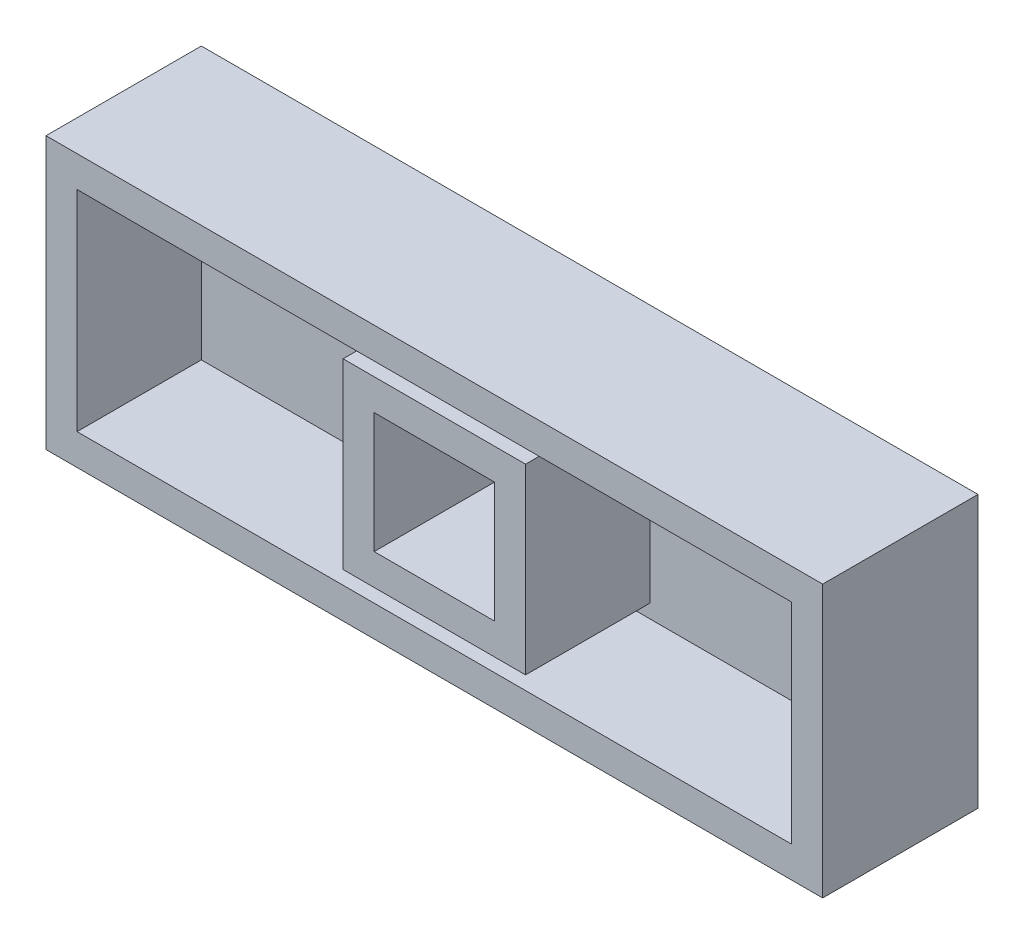
ISO-10303-21;
HEADER;
FILE_DESCRIPTION(('STEP AP214'),'2;1');
FILE_NAME('part.step','',(''),(''),'','','');
FILE_SCHEMA(('AUTOMOTIVE_DESIGN { 1 0 10303 214 1 1 1 1 }'));
ENDSEC;
DATA;
#1=APPLICATION_CONTEXT('core data for automotive mechanical design processes');
#2=APPLICATION_PROTOCOL_DEFINITION('international standard','automotive_design',2000,#1);
#3=PRODUCT_CONTEXT('',#1,'mechanical');
#4=PRODUCT('Part','Part','',(#3));
#5=PRODUCT_RELATED_PRODUCT_CATEGORY('part','',(#4));
#6=PRODUCT_DEFINITION_FORMATION('','',#4);
#7=PRODUCT_DEFINITION_CONTEXT('part definition',#1,'design');
#8=PRODUCT_DEFINITION('design','',#6,#7);
#9=PRODUCT_DEFINITION_SHAPE('','',#8);
#10=(LENGTH_UNIT() NAMED_UNIT(*) SI_UNIT(.MILLI.,.METRE.));
#11=(NAMED_UNIT(*) PLANE_ANGLE_UNIT() SI_UNIT($,.RADIAN.));
#12=(NAMED_UNIT(*) SI_UNIT($,.STERADIAN.) SOLID_ANGLE_UNIT());
#13=UNCERTAINTY_MEASURE_WITH_UNIT(LENGTH_MEASURE(1.E-05),#10,'distance_accuracy_value','');
#14=(GEOMETRIC_REPRESENTATION_CONTEXT(3) GLOBAL_UNCERTAINTY_ASSIGNED_CONTEXT((#13)) GLOBAL_UNIT_ASSIGNED_CONTEXT((#10,
#11,#12)) REPRESENTATION_CONTEXT('',''));
#15=CARTESIAN_POINT('',(0.,0.,0.));
#16=DIRECTION('',(0.,0.,1.));
#17=DIRECTION('',(1.,0.,0.));
#18=AXIS2_PLACEMENT_3D('',#15,#16,#17);
#19=CARTESIAN_POINT('',(0.,0.,4.));
#20=DIRECTION('',(0.,0.,-1.));
#21=DIRECTION('',(-1.,0.,0.));
#22=AXIS2_PLACEMENT_3D('',#19,#20,#21);
#23=PLANE('',#22);
#24=DIRECTION('',(0.,-1.,0.));
#25=VECTOR('',#24,1.);
#26=CARTESIAN_POINT('',(-8.45,-1.95,4.));
#27=LINE('',#26,#25);
#28=CARTESIAN_POINT('',(-8.45,5.05,4.));
#29=VERTEX_POINT('',#28);
#30=CARTESIAN_POINT('',(-8.45,-1.95,4.));
#31=VERTEX_POINT('',#30);
#32=EDGE_CURVE('E291',#29,#31,#27,.T.);
#33=ORIENTED_EDGE('',*,*,#32,.T.);
#34=DIRECTION('',(1.,0.,0.));
#35=VECTOR('',#34,1.);
#36=CARTESIAN_POINT('',(-8.45,-1.95,4.));
#37=LINE('',#36,#35);
#38=CARTESIAN_POINT('',(11.55,-1.95,4.));
#39=VERTEX_POINT('',#38);
#40=EDGE_CURVE('E295',#31,#39,#37,.T.);
#41=ORIENTED_EDGE('',*,*,#40,.T.);
#42=DIRECTION('',(0.,1.,0.));
#43=VECTOR('',#42,1.);
#44=CARTESIAN_POINT('',(11.55,-1.95,4.));
#45=LINE('',#44,#43);
#46=CARTESIAN_POINT('',(11.55,5.05,4.));
#47=VERTEX_POINT('',#46);
#48=EDGE_CURVE('E299',#39,#47,#45,.T.);
#49=ORIENTED_EDGE('',*,*,#48,.T.);
#50=DIRECTION('',(-1.,0.,0.));
#51=VECTOR('',#50,1.);
#52=CARTESIAN_POINT('',(-8.45,5.05,4.));
#53=LINE('',#52,#51);
#54=EDGE_CURVE('E302',#47,#29,#53,.T.);
#55=ORIENTED_EDGE('',*,*,#54,.T.);
#56=EDGE_LOOP('',(#33,#41,#49,#55));
#57=FACE_BOUND('',#56,.T.);
#58=DIRECTION('',(0.,-1.,0.));
#59=VECTOR('',#58,1.);
#60=CARTESIAN_POINT('',(-7.65,0.,4.));
#61=LINE('',#60,#59);
#62=CARTESIAN_POINT('',(-7.65,4.25,4.));
#63=VERTEX_POINT('',#62);
#64=CARTESIAN_POINT('',(-7.65,-1.15,4.));
#65=VERTEX_POINT('',#64);
#66=EDGE_CURVE('E162',#63,#65,#61,.T.);
#67=ORIENTED_EDGE('',*,*,#66,.F.);
#68=DIRECTION('',(-1.,0.,0.));
#69=VECTOR('',#68,1.);
#70=CARTESIAN_POINT('',(0.,4.25,4.));
#71=LINE('',#70,#69);
#72=CARTESIAN_POINT('',(10.75,4.25,4.));
#73=VERTEX_POINT('',#72);
#74=EDGE_CURVE('E168',#73,#63,#71,.T.);
#75=ORIENTED_EDGE('',*,*,#74,.F.);
#76=DIRECTION('',(0.,1.,0.));
#77=VECTOR('',#76,1.);
#78=CARTESIAN_POINT('',(10.75,0.,4.));
#79=LINE('',#78,#77);
#80=CARTESIAN_POINT('',(10.75,-1.15,4.));
#81=VERTEX_POINT('',#80);
#82=EDGE_CURVE('E231',#81,#73,#79,.T.);
#83=ORIENTED_EDGE('',*,*,#82,.F.);
#84=DIRECTION('',(1.,0.,0.));
#85=VECTOR('',#84,1.);
#86=CARTESIAN_POINT('',(0.,-1.15,4.));
#87=LINE('',#86,#85);
#88=EDGE_CURVE('E228',#65,#81,#87,.T.);
#89=ORIENTED_EDGE('',*,*,#88,.F.);
#90=EDGE_LOOP('',(#67,#75,#83,#89));
#91=FACE_BOUND('',#90,.T.);
#92=ADVANCED_FACE('F39',(#57,#91),#23,.F.);
#93=DIRECTION('',(-1.,0.,0.));
#94=VECTOR('',#93,1.);
#95=CARTESIAN_POINT('',(0.,3.9,4.));
#96=LINE('',#95,#94);
#97=CARTESIAN_POINT('',(3.9,3.9,4.));
#98=VERTEX_POINT('',#97);
#99=CARTESIAN_POINT('',(-0.8,3.9,4.));
#100=VERTEX_POINT('',#99);
#101=EDGE_CURVE('E220',#98,#100,#96,.T.);
#102=ORIENTED_EDGE('',*,*,#101,.T.);
#103=DIRECTION('',(0.,-1.,0.));
#104=VECTOR('',#103,1.);
#105=CARTESIAN_POINT('',(-0.8,0.,4.));
#106=LINE('',#105,#104);
#107=CARTESIAN_POINT('',(-0.8,-0.8,4.));
#108=VERTEX_POINT('',#107);
#109=EDGE_CURVE('E194',#100,#108,#106,.T.);
#110=ORIENTED_EDGE('',*,*,#109,.T.);
#111=DIRECTION('',(1.,0.,0.));
#112=VECTOR('',#111,1.);
#113=CARTESIAN_POINT('',(0.,-0.8,4.));
#114=LINE('',#113,#112);
#115=CARTESIAN_POINT('',(3.9,-0.8,4.));
#116=VERTEX_POINT('',#115);
#117=EDGE_CURVE('E239',#108,#116,#114,.T.);
#118=ORIENTED_EDGE('',*,*,#117,.T.);
#119=DIRECTION('',(0.,1.,0.));
#120=VECTOR('',#119,1.);
#121=CARTESIAN_POINT('',(3.9,0.,4.));
#122=LINE('',#121,#120);
#123=EDGE_CURVE('E63',#116,#98,#122,.T.);
#124=ORIENTED_EDGE('',*,*,#123,.T.);
#125=EDGE_LOOP('',(#102,#110,#118,#124));
#126=FACE_BOUND('',#125,.T.);
#127=DIRECTION('',(0.,-1.,0.));
#128=VECTOR('',#127,1.);
#129=CARTESIAN_POINT('',(0.,0.,4.));
#130=LINE('',#129,#128);
#131=CARTESIAN_POINT('',(0.,3.1,4.));
#132=VERTEX_POINT('',#131);
#133=CARTESIAN_POINT('',(0.,0.,4.));
#134=VERTEX_POINT('',#133);
#135=EDGE_CURVE('E248',#132,#134,#130,.T.);
#136=ORIENTED_EDGE('',*,*,#135,.F.);
#137=DIRECTION('',(-1.,0.,0.));
#138=VECTOR('',#137,1.);
#139=CARTESIAN_POINT('',(0.,3.1,4.));
#140=LINE('',#139,#138);
#141=CARTESIAN_POINT('',(3.1,3.1,4.));
#142=VERTEX_POINT('',#141);
#143=EDGE_CURVE('E259',#142,#132,#140,.T.);
#144=ORIENTED_EDGE('',*,*,#143,.F.);
#145=DIRECTION('',(0.,1.,0.));
#146=VECTOR('',#145,1.);
#147=CARTESIAN_POINT('',(3.1,0.,4.));
#148=LINE('',#147,#146);
#149=CARTESIAN_POINT('',(3.1,0.,4.));
#150=VERTEX_POINT('',#149);
#151=EDGE_CURVE('E255',#150,#142,#148,.T.);
#152=ORIENTED_EDGE('',*,*,#151,.F.);
#153=DIRECTION('',(1.,0.,0.));
#154=VECTOR('',#153,1.);
#155=CARTESIAN_POINT('',(0.,0.,4.));
#156=LINE('',#155,#154);
#157=EDGE_CURVE('E251',#134,#150,#156,.T.);
#158=ORIENTED_EDGE('',*,*,#157,.F.);
#159=EDGE_LOOP('',(#136,#144,#152,#158));
#160=FACE_BOUND('',#159,.T.);
#161=ADVANCED_FACE('F354',(#126,#160),#23,.F.);
#162=CARTESIAN_POINT('',(0.,0.,0.));
#163=DIRECTION('',(0.,0.,-1.));
#164=DIRECTION('',(-1.,0.,0.));
#165=AXIS2_PLACEMENT_3D('',#162,#163,#164);
#166=PLANE('',#165);
#167=DIRECTION('',(0.,-1.,0.));
#168=VECTOR('',#167,1.);
#169=CARTESIAN_POINT('',(-8.45,-1.95,0.));
#170=LINE('',#169,#168);
#171=CARTESIAN_POINT('',(-8.45,5.05,0.));
#172=VERTEX_POINT('',#171);
#173=CARTESIAN_POINT('',(-8.45,-1.95,0.));
#174=VERTEX_POINT('',#173);
#175=EDGE_CURVE('E290',#172,#174,#170,.T.);
#176=ORIENTED_EDGE('',*,*,#175,.F.);
#177=DIRECTION('',(-1.,0.,0.));
#178=VECTOR('',#177,1.);
#179=CARTESIAN_POINT('',(-8.45,5.05,0.));
#180=LINE('',#179,#178);
#181=CARTESIAN_POINT('',(11.55,5.05,0.));
#182=VERTEX_POINT('',#181);
#183=EDGE_CURVE('E296',#182,#172,#180,.T.);
#184=ORIENTED_EDGE('',*,*,#183,.F.);
#185=DIRECTION('',(0.,1.,0.));
#186=VECTOR('',#185,1.);
#187=CARTESIAN_POINT('',(11.55,-1.95,0.));
#188=LINE('',#187,#186);
#189=CARTESIAN_POINT('',(11.55,-1.95,0.));
#190=VERTEX_POINT('',#189);
#191=EDGE_CURVE('E312',#190,#182,#188,.T.);
#192=ORIENTED_EDGE('',*,*,#191,.F.);
#193=DIRECTION('',(1.,0.,0.));
#194=VECTOR('',#193,1.);
#195=CARTESIAN_POINT('',(-8.45,-1.95,0.));
#196=LINE('',#195,#194);
#197=EDGE_CURVE('E309',#174,#190,#196,.T.);
#198=ORIENTED_EDGE('',*,*,#197,.F.);
#199=EDGE_LOOP('',(#176,#184,#192,#198));
#200=FACE_BOUND('',#199,.T.);
#201=DIRECTION('',(-1.,0.,0.));
#202=VECTOR('',#201,1.);
#203=CARTESIAN_POINT('',(0.,3.1,0.));
#204=LINE('',#203,#202);
#205=CARTESIAN_POINT('',(3.1,3.1,0.));
#206=VERTEX_POINT('',#205);
#207=CARTESIAN_POINT('',(0.,3.1,0.));
#208=VERTEX_POINT('',#207);
#209=EDGE_CURVE('E252',#206,#208,#204,.T.);
#210=ORIENTED_EDGE('',*,*,#209,.T.);
#211=DIRECTION('',(0.,-1.,0.));
#212=VECTOR('',#211,1.);
#213=CARTESIAN_POINT('',(0.,0.,0.));
#214=LINE('',#213,#212);
#215=CARTESIAN_POINT('',(0.,0.,0.));
#216=VERTEX_POINT('',#215);
#217=EDGE_CURVE('E208',#208,#216,#214,.T.);
#218=ORIENTED_EDGE('',*,*,#217,.T.);
#219=DIRECTION('',(1.,0.,0.));
#220=VECTOR('',#219,1.);
#221=CARTESIAN_POINT('',(0.,0.,0.));
#222=LINE('',#221,#220);
#223=CARTESIAN_POINT('',(3.1,0.,0.));
#224=VERTEX_POINT('',#223);
#225=EDGE_CURVE('E266',#216,#224,#222,.T.);
#226=ORIENTED_EDGE('',*,*,#225,.T.);
#227=DIRECTION('',(0.,1.,0.));
#228=VECTOR('',#227,1.);
#229=CARTESIAN_POINT('',(3.1,0.,0.));
#230=LINE('',#229,#228);
#231=EDGE_CURVE('E270',#224,#206,#230,.T.);
#232=ORIENTED_EDGE('',*,*,#231,.T.);
#233=EDGE_LOOP('',(#210,#218,#226,#232));
#234=FACE_BOUND('',#233,.T.);
#235=ADVANCED_FACE('F335',(#200,#234),#166,.T.);
#236=CARTESIAN_POINT('',(-8.45,-1.95,4.));
#237=DIRECTION('',(1.,0.,0.));
#238=DIRECTION('',(0.,0.,-1.));
#239=AXIS2_PLACEMENT_3D('',#236,#237,#238);
#240=PLANE('',#239);
#241=ORIENTED_EDGE('',*,*,#175,.T.);
#242=DIRECTION('',(0.,0.,-1.));
#243=VECTOR('',#242,1.);
#244=CARTESIAN_POINT('',(-8.45,-1.95,4.));
#245=LINE('',#244,#243);
#246=EDGE_CURVE('E11',#31,#174,#245,.T.);
#247=ORIENTED_EDGE('',*,*,#246,.F.);
#248=ORIENTED_EDGE('',*,*,#32,.F.);
#249=DIRECTION('',(0.,0.,-1.));
#250=VECTOR('',#249,1.);
#251=CARTESIAN_POINT('',(-8.45,5.05,4.));
#252=LINE('',#251,#250);
#253=EDGE_CURVE('E305',#29,#172,#252,.T.);
#254=ORIENTED_EDGE('',*,*,#253,.T.);
#255=EDGE_LOOP('',(#241,#247,#248,#254));
#256=FACE_BOUND('',#255,.T.);
#257=ADVANCED_FACE('F41',(#256),#240,.F.);
#258=CARTESIAN_POINT('',(-8.45,-1.95,4.));
#259=DIRECTION('',(0.,1.,0.));
#260=DIRECTION('',(0.,0.,1.));
#261=AXIS2_PLACEMENT_3D('',#258,#259,#260);
#262=PLANE('',#261);
#263=ORIENTED_EDGE('',*,*,#197,.T.);
#264=DIRECTION('',(0.,0.,-1.));
#265=VECTOR('',#264,1.);
#266=CARTESIAN_POINT('',(11.55,-1.95,4.));
#267=LINE('',#266,#265);
#268=EDGE_CURVE('E48',#39,#190,#267,.T.);
#269=ORIENTED_EDGE('',*,*,#268,.F.);
#270=ORIENTED_EDGE('',*,*,#40,.F.);
#271=ORIENTED_EDGE('',*,*,#246,.T.);
#272=EDGE_LOOP('',(#263,#269,#270,#271));
#273=FACE_BOUND('',#272,.T.);
#274=ADVANCED_FACE('F346',(#273),#262,.F.);
#275=CARTESIAN_POINT('',(11.55,-1.95,4.));
#276=DIRECTION('',(-1.,0.,0.));
#277=DIRECTION('',(0.,0.,1.));
#278=AXIS2_PLACEMENT_3D('',#275,#276,#277);
#279=PLANE('',#278);
#280=ORIENTED_EDGE('',*,*,#191,.T.);
#281=DIRECTION('',(0.,0.,-1.));
#282=VECTOR('',#281,1.);
#283=CARTESIAN_POINT('',(11.55,5.05,4.));
#284=LINE('',#283,#282);
#285=EDGE_CURVE('E320',#47,#182,#284,.T.);
#286=ORIENTED_EDGE('',*,*,#285,.F.);
#287=ORIENTED_EDGE('',*,*,#48,.F.);
#288=ORIENTED_EDGE('',*,*,#268,.T.);
#289=EDGE_LOOP('',(#280,#286,#287,#288));
#290=FACE_BOUND('',#289,.T.);
#291=ADVANCED_FACE('F329',(#290),#279,.F.);
#292=CARTESIAN_POINT('',(-8.45,5.05,4.));
#293=DIRECTION('',(0.,-1.,0.));
#294=DIRECTION('',(0.,0.,-1.));
#295=AXIS2_PLACEMENT_3D('',#292,#293,#294);
#296=PLANE('',#295);
#297=ORIENTED_EDGE('',*,*,#183,.T.);
#298=ORIENTED_EDGE('',*,*,#253,.F.);
#299=ORIENTED_EDGE('',*,*,#54,.F.);
#300=ORIENTED_EDGE('',*,*,#285,.T.);
#301=EDGE_LOOP('',(#297,#298,#299,#300));
#302=FACE_BOUND('',#301,.T.);
#303=ADVANCED_FACE('F339',(#302),#296,.F.);
#304=CARTESIAN_POINT('',(0.,0.,4.));
#305=DIRECTION('',(1.,0.,0.));
#306=DIRECTION('',(0.,0.,-1.));
#307=AXIS2_PLACEMENT_3D('',#304,#305,#306);
#308=PLANE('',#307);
#309=ORIENTED_EDGE('',*,*,#217,.F.);
#310=DIRECTION('',(0.,0.,-1.));
#311=VECTOR('',#310,1.);
#312=CARTESIAN_POINT('',(0.,3.1,4.));
#313=LINE('',#312,#311);
#314=EDGE_CURVE('E262',#132,#208,#313,.T.);
#315=ORIENTED_EDGE('',*,*,#314,.F.);
#316=ORIENTED_EDGE('',*,*,#135,.T.);
#317=DIRECTION('',(0.,0.,-1.));
#318=VECTOR('',#317,1.);
#319=CARTESIAN_POINT('',(0.,0.,4.));
#320=LINE('',#319,#318);
#321=EDGE_CURVE('E286',#134,#216,#320,.T.);
#322=ORIENTED_EDGE('',*,*,#321,.T.);
#323=EDGE_LOOP('',(#309,#315,#316,#322));
#324=FACE_BOUND('',#323,.T.);
#325=ADVANCED_FACE('F362',(#324),#308,.T.);
#326=CARTESIAN_POINT('',(0.,0.,4.));
#327=DIRECTION('',(0.,1.,0.));
#328=DIRECTION('',(0.,0.,1.));
#329=AXIS2_PLACEMENT_3D('',#326,#327,#328);
#330=PLANE('',#329);
#331=ORIENTED_EDGE('',*,*,#225,.F.);
#332=ORIENTED_EDGE('',*,*,#321,.F.);
#333=ORIENTED_EDGE('',*,*,#157,.T.);
#334=DIRECTION('',(0.,0.,-1.));
#335=VECTOR('',#334,1.);
#336=CARTESIAN_POINT('',(3.1,0.,4.));
#337=LINE('',#336,#335);
#338=EDGE_CURVE('E283',#150,#224,#337,.T.);
#339=ORIENTED_EDGE('',*,*,#338,.T.);
#340=EDGE_LOOP('',(#331,#332,#333,#339));
#341=FACE_BOUND('',#340,.T.);
#342=ADVANCED_FACE('F370',(#341),#330,.T.);
#343=CARTESIAN_POINT('',(3.1,0.,4.));
#344=DIRECTION('',(-1.,0.,0.));
#345=DIRECTION('',(0.,0.,1.));
#346=AXIS2_PLACEMENT_3D('',#343,#344,#345);
#347=PLANE('',#346);
#348=ORIENTED_EDGE('',*,*,#231,.F.);
#349=ORIENTED_EDGE('',*,*,#338,.F.);
#350=ORIENTED_EDGE('',*,*,#151,.T.);
#351=DIRECTION('',(0.,0.,-1.));
#352=VECTOR('',#351,1.);
#353=CARTESIAN_POINT('',(3.1,3.1,4.));
#354=LINE('',#353,#352);
#355=EDGE_CURVE('E280',#142,#206,#354,.T.);
#356=ORIENTED_EDGE('',*,*,#355,.T.);
#357=EDGE_LOOP('',(#348,#349,#350,#356));
#358=FACE_BOUND('',#357,.T.);
#359=ADVANCED_FACE('F375',(#358),#347,.T.);
#360=CARTESIAN_POINT('',(0.,3.1,4.));
#361=DIRECTION('',(0.,-1.,0.));
#362=DIRECTION('',(0.,0.,-1.));
#363=AXIS2_PLACEMENT_3D('',#360,#361,#362);
#364=PLANE('',#363);
#365=ORIENTED_EDGE('',*,*,#209,.F.);
#366=ORIENTED_EDGE('',*,*,#355,.F.);
#367=ORIENTED_EDGE('',*,*,#143,.T.);
#368=ORIENTED_EDGE('',*,*,#314,.T.);
#369=EDGE_LOOP('',(#365,#366,#367,#368));
#370=FACE_BOUND('',#369,.T.);
#371=ADVANCED_FACE('F382',(#370),#364,.T.);
#372=CARTESIAN_POINT('',(0.,0.,0.8));
#373=DIRECTION('',(0.,0.,-1.));
#374=DIRECTION('',(-1.,0.,0.));
#375=AXIS2_PLACEMENT_3D('',#372,#373,#374);
#376=PLANE('',#375);
#377=DIRECTION('',(0.,-1.,0.));
#378=VECTOR('',#377,1.);
#379=CARTESIAN_POINT('',(-7.65,0.,0.8));
#380=LINE('',#379,#378);
#381=CARTESIAN_POINT('',(-7.65,4.25,0.8));
#382=VERTEX_POINT('',#381);
#383=CARTESIAN_POINT('',(-7.65,-1.15,0.8));
#384=VERTEX_POINT('',#383);
#385=EDGE_CURVE('E158',#382,#384,#380,.T.);
#386=ORIENTED_EDGE('',*,*,#385,.T.);
#387=DIRECTION('',(1.,0.,0.));
#388=VECTOR('',#387,1.);
#389=CARTESIAN_POINT('',(0.,-1.15,0.8));
#390=LINE('',#389,#388);
#391=CARTESIAN_POINT('',(10.75,-1.15,0.8));
#392=VERTEX_POINT('',#391);
#393=EDGE_CURVE('E178',#384,#392,#390,.T.);
#394=ORIENTED_EDGE('',*,*,#393,.T.);
#395=DIRECTION('',(0.,1.,0.));
#396=VECTOR('',#395,1.);
#397=CARTESIAN_POINT('',(10.75,0.,0.8));
#398=LINE('',#397,#396);
#399=CARTESIAN_POINT('',(10.75,4.25,0.8));
#400=VERTEX_POINT('',#399);
#401=EDGE_CURVE('E160',#392,#400,#398,.T.);
#402=ORIENTED_EDGE('',*,*,#401,.T.);
#403=DIRECTION('',(-1.,0.,0.));
#404=VECTOR('',#403,1.);
#405=CARTESIAN_POINT('',(0.,4.25,0.8));
#406=LINE('',#405,#404);
#407=EDGE_CURVE('E153',#400,#382,#406,.T.);
#408=ORIENTED_EDGE('',*,*,#407,.T.);
#409=EDGE_LOOP('',(#386,#394,#402,#408));
#410=FACE_BOUND('',#409,.T.);
#411=DIRECTION('',(-1.,0.,0.));
#412=VECTOR('',#411,1.);
#413=CARTESIAN_POINT('',(0.,3.9,0.8));
#414=LINE('',#413,#412);
#415=CARTESIAN_POINT('',(3.9,3.9,0.8));
#416=VERTEX_POINT('',#415);
#417=CARTESIAN_POINT('',(-0.8,3.9,0.8));
#418=VERTEX_POINT('',#417);
#419=EDGE_CURVE('E190',#416,#418,#414,.T.);
#420=ORIENTED_EDGE('',*,*,#419,.F.);
#421=DIRECTION('',(0.,1.,0.));
#422=VECTOR('',#421,1.);
#423=CARTESIAN_POINT('',(3.9,0.,0.8));
#424=LINE('',#423,#422);
#425=CARTESIAN_POINT('',(3.9,-0.8,0.8));
#426=VERTEX_POINT('',#425);
#427=EDGE_CURVE('E195',#426,#416,#424,.T.);
#428=ORIENTED_EDGE('',*,*,#427,.F.);
#429=DIRECTION('',(1.,0.,0.));
#430=VECTOR('',#429,1.);
#431=CARTESIAN_POINT('',(0.,-0.8,0.8));
#432=LINE('',#431,#430);
#433=CARTESIAN_POINT('',(-0.8,-0.8,0.8));
#434=VERTEX_POINT('',#433);
#435=EDGE_CURVE('E200',#434,#426,#432,.T.);
#436=ORIENTED_EDGE('',*,*,#435,.F.);
#437=DIRECTION('',(0.,-1.,0.));
#438=VECTOR('',#437,1.);
#439=CARTESIAN_POINT('',(-0.8,0.,0.8));
#440=LINE('',#439,#438);
#441=EDGE_CURVE('E196',#418,#434,#440,.T.);
#442=ORIENTED_EDGE('',*,*,#441,.F.);
#443=EDGE_LOOP('',(#420,#428,#436,#442));
#444=FACE_BOUND('',#443,.T.);
#445=ADVANCED_FACE('F155',(#410,#444),#376,.F.);
#446=CARTESIAN_POINT('',(-7.65,-1.95,4.));
#447=DIRECTION('',(1.,0.,0.));
#448=DIRECTION('',(0.,0.,-1.));
#449=AXIS2_PLACEMENT_3D('',#446,#447,#448);
#450=PLANE('',#449);
#451=ORIENTED_EDGE('',*,*,#385,.F.);
#452=DIRECTION('',(0.,0.,-1.));
#453=VECTOR('',#452,1.);
#454=CARTESIAN_POINT('',(-7.65,4.25,4.));
#455=LINE('',#454,#453);
#456=EDGE_CURVE('E165',#63,#382,#455,.T.);
#457=ORIENTED_EDGE('',*,*,#456,.F.);
#458=ORIENTED_EDGE('',*,*,#66,.T.);
#459=DIRECTION('',(0.,0.,-1.));
#460=VECTOR('',#459,1.);
#461=CARTESIAN_POINT('',(-7.65,-1.15,4.));
#462=LINE('',#461,#460);
#463=EDGE_CURVE('E176',#65,#384,#462,.T.);
#464=ORIENTED_EDGE('',*,*,#463,.T.);
#465=EDGE_LOOP('',(#451,#457,#458,#464));
#466=FACE_BOUND('',#465,.T.);
#467=ADVANCED_FACE('F174',(#466),#450,.T.);
#468=CARTESIAN_POINT('',(-8.45,-1.15,4.));
#469=DIRECTION('',(0.,1.,0.));
#470=DIRECTION('',(0.,0.,1.));
#471=AXIS2_PLACEMENT_3D('',#468,#469,#470);
#472=PLANE('',#471);
#473=ORIENTED_EDGE('',*,*,#393,.F.);
#474=ORIENTED_EDGE('',*,*,#463,.F.);
#475=ORIENTED_EDGE('',*,*,#88,.T.);
#476=DIRECTION('',(0.,0.,-1.));
#477=VECTOR('',#476,1.);
#478=CARTESIAN_POINT('',(10.75,-1.15,4.));
#479=LINE('',#478,#477);
#480=EDGE_CURVE('E209',#81,#392,#479,.T.);
#481=ORIENTED_EDGE('',*,*,#480,.T.);
#482=EDGE_LOOP('',(#473,#474,#475,#481));
#483=FACE_BOUND('',#482,.T.);
#484=ADVANCED_FACE('F417',(#483),#472,.T.);
#485=CARTESIAN_POINT('',(10.75,-1.95,4.));
#486=DIRECTION('',(-1.,0.,0.));
#487=DIRECTION('',(0.,0.,1.));
#488=AXIS2_PLACEMENT_3D('',#485,#486,#487);
#489=PLANE('',#488);
#490=ORIENTED_EDGE('',*,*,#401,.F.);
#491=ORIENTED_EDGE('',*,*,#480,.F.);
#492=ORIENTED_EDGE('',*,*,#82,.T.);
#493=DIRECTION('',(0.,0.,-1.));
#494=VECTOR('',#493,1.);
#495=CARTESIAN_POINT('',(10.75,4.25,4.));
#496=LINE('',#495,#494);
#497=EDGE_CURVE('E55',#73,#400,#496,.T.);
#498=ORIENTED_EDGE('',*,*,#497,.T.);
#499=EDGE_LOOP('',(#490,#491,#492,#498));
#500=FACE_BOUND('',#499,.T.);
#501=ADVANCED_FACE('F414',(#500),#489,.T.);
#502=CARTESIAN_POINT('',(-8.45,4.25,4.));
#503=DIRECTION('',(0.,-1.,0.));
#504=DIRECTION('',(0.,0.,-1.));
#505=AXIS2_PLACEMENT_3D('',#502,#503,#504);
#506=PLANE('',#505);
#507=ORIENTED_EDGE('',*,*,#407,.F.);
#508=ORIENTED_EDGE('',*,*,#497,.F.);
#509=ORIENTED_EDGE('',*,*,#74,.T.);
#510=ORIENTED_EDGE('',*,*,#456,.T.);
#511=EDGE_LOOP('',(#507,#508,#509,#510));
#512=FACE_BOUND('',#511,.T.);
#513=ADVANCED_FACE('F166',(#512),#506,.T.);
#514=CARTESIAN_POINT('',(-0.8,0.,4.));
#515=DIRECTION('',(1.,0.,0.));
#516=DIRECTION('',(0.,0.,-1.));
#517=AXIS2_PLACEMENT_3D('',#514,#515,#516);
#518=PLANE('',#517);
#519=ORIENTED_EDGE('',*,*,#441,.T.);
#520=DIRECTION('',(0.,0.,-1.));
#521=VECTOR('',#520,1.);
#522=CARTESIAN_POINT('',(-0.8,-0.8,4.));
#523=LINE('',#522,#521);
#524=EDGE_CURVE('E179',#108,#434,#523,.T.);
#525=ORIENTED_EDGE('',*,*,#524,.F.);
#526=ORIENTED_EDGE('',*,*,#109,.F.);
#527=DIRECTION('',(0.,0.,-1.));
#528=VECTOR('',#527,1.);
#529=CARTESIAN_POINT('',(-0.8,3.9,4.));
#530=LINE('',#529,#528);
#531=EDGE_CURVE('E216',#100,#418,#530,.T.);
#532=ORIENTED_EDGE('',*,*,#531,.T.);
#533=EDGE_LOOP('',(#519,#525,#526,#532));
#534=FACE_BOUND('',#533,.T.);
#535=ADVANCED_FACE('F407',(#534),#518,.F.);
#536=CARTESIAN_POINT('',(0.,-0.8,4.));
#537=DIRECTION('',(0.,1.,0.));
#538=DIRECTION('',(0.,0.,1.));
#539=AXIS2_PLACEMENT_3D('',#536,#537,#538);
#540=PLANE('',#539);
#541=ORIENTED_EDGE('',*,*,#435,.T.);
#542=DIRECTION('',(0.,0.,-1.));
#543=VECTOR('',#542,1.);
#544=CARTESIAN_POINT('',(3.9,-0.8,4.));
#545=LINE('',#544,#543);
#546=EDGE_CURVE('E185',#116,#426,#545,.T.);
#547=ORIENTED_EDGE('',*,*,#546,.F.);
#548=ORIENTED_EDGE('',*,*,#117,.F.);
#549=ORIENTED_EDGE('',*,*,#524,.T.);
#550=EDGE_LOOP('',(#541,#547,#548,#549));
#551=FACE_BOUND('',#550,.T.);
#552=ADVANCED_FACE('F404',(#551),#540,.F.);
#553=CARTESIAN_POINT('',(3.9,0.,4.));
#554=DIRECTION('',(-1.,0.,0.));
#555=DIRECTION('',(0.,0.,1.));
#556=AXIS2_PLACEMENT_3D('',#553,#554,#555);
#557=PLANE('',#556);
#558=ORIENTED_EDGE('',*,*,#427,.T.);
#559=DIRECTION('',(0.,0.,-1.));
#560=VECTOR('',#559,1.);
#561=CARTESIAN_POINT('',(3.9,3.9,4.));
#562=LINE('',#561,#560);
#563=EDGE_CURVE('E219',#98,#416,#562,.T.);
#564=ORIENTED_EDGE('',*,*,#563,.F.);
#565=ORIENTED_EDGE('',*,*,#123,.F.);
#566=ORIENTED_EDGE('',*,*,#546,.T.);
#567=EDGE_LOOP('',(#558,#564,#565,#566));
#568=FACE_BOUND('',#567,.T.);
#569=ADVANCED_FACE('F400',(#568),#557,.F.);
#570=CARTESIAN_POINT('',(0.,3.9,4.));
#571=DIRECTION('',(0.,-1.,0.));
#572=DIRECTION('',(0.,0.,-1.));
#573=AXIS2_PLACEMENT_3D('',#570,#571,#572);
#574=PLANE('',#573);
#575=ORIENTED_EDGE('',*,*,#419,.T.);
#576=ORIENTED_EDGE('',*,*,#531,.F.);
#577=ORIENTED_EDGE('',*,*,#101,.F.);
#578=ORIENTED_EDGE('',*,*,#563,.T.);
#579=EDGE_LOOP('',(#575,#576,#577,#578));
#580=FACE_BOUND('',#579,.T.);
#581=ADVANCED_FACE('F397',(#580),#574,.F.);
#582=CLOSED_SHELL('',(#92,#161,#235,#257,#274,#291,#303,#325,#342,#359,#371,#445,#467,#484,#501,
#513,#535,#552,#569,#581));
#583=MANIFOLD_SOLID_BREP('B2',#582);
#584=ADVANCED_BREP_SHAPE_REPRESENTATION('',(#18,#583),#14);
#585=SHAPE_DEFINITION_REPRESENTATION(#9,#584);
ENDSEC;
END-ISO-10303-21;
